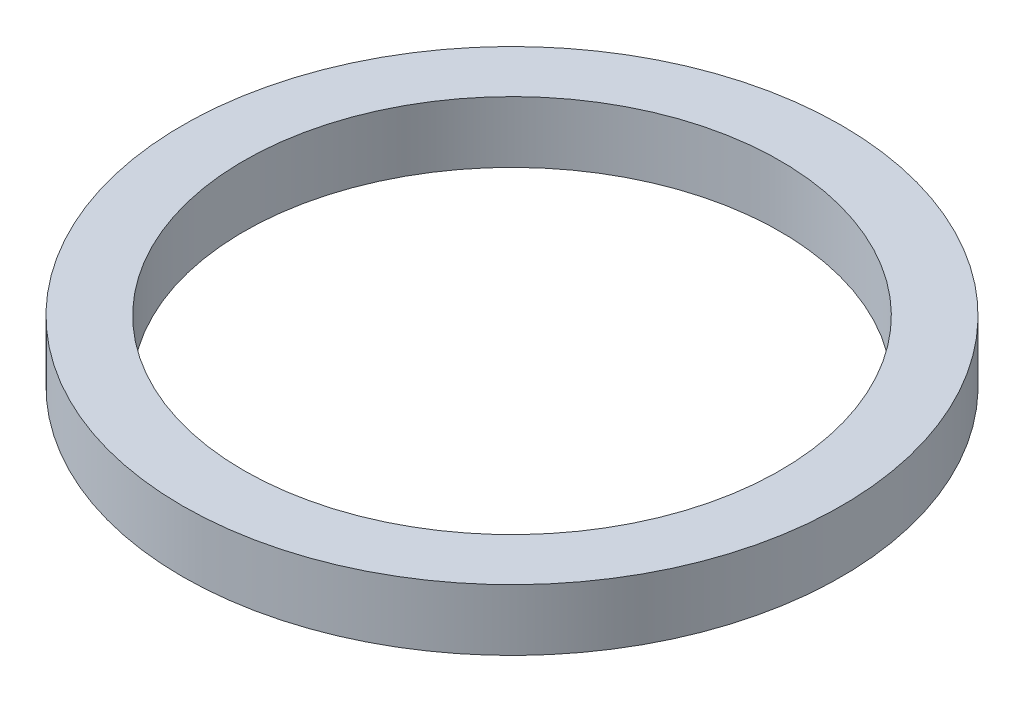
ISO-10303-21;
HEADER;
FILE_DESCRIPTION(('STEP AP214'),'2;1');
FILE_NAME('part.step','',(''),(''),'','','');
FILE_SCHEMA(('AUTOMOTIVE_DESIGN { 1 0 10303 214 1 1 1 1 }'));
ENDSEC;
DATA;
#1=APPLICATION_CONTEXT('core data for automotive mechanical design processes');
#2=APPLICATION_PROTOCOL_DEFINITION('international standard','automotive_design',2000,#1);
#3=PRODUCT_CONTEXT('',#1,'mechanical');
#4=PRODUCT('Part','Part','',(#3));
#5=PRODUCT_RELATED_PRODUCT_CATEGORY('part','',(#4));
#6=PRODUCT_DEFINITION_FORMATION('','',#4);
#7=PRODUCT_DEFINITION_CONTEXT('part definition',#1,'design');
#8=PRODUCT_DEFINITION('design','',#6,#7);
#9=PRODUCT_DEFINITION_SHAPE('','',#8);
#10=(LENGTH_UNIT() NAMED_UNIT(*) SI_UNIT(.MILLI.,.METRE.));
#11=(NAMED_UNIT(*) PLANE_ANGLE_UNIT() SI_UNIT($,.RADIAN.));
#12=(NAMED_UNIT(*) SI_UNIT($,.STERADIAN.) SOLID_ANGLE_UNIT());
#13=UNCERTAINTY_MEASURE_WITH_UNIT(LENGTH_MEASURE(1.E-05),#10,'distance_accuracy_value','');
#14=(GEOMETRIC_REPRESENTATION_CONTEXT(3) GLOBAL_UNCERTAINTY_ASSIGNED_CONTEXT((#13)) GLOBAL_UNIT_ASSIGNED_CONTEXT((#10,
#11,#12)) REPRESENTATION_CONTEXT('',''));
#15=CARTESIAN_POINT('',(0.,0.,0.));
#16=DIRECTION('',(0.,0.,1.));
#17=DIRECTION('',(1.,0.,0.));
#18=AXIS2_PLACEMENT_3D('',#15,#16,#17);
#19=CARTESIAN_POINT('',(0.,8.,0.));
#20=DIRECTION('',(0.,1.,0.));
#21=DIRECTION('',(0.,0.,1.));
#22=AXIS2_PLACEMENT_3D('',#19,#20,#21);
#23=PLANE('',#22);
#24=CARTESIAN_POINT('',(0.,8.,0.));
#25=DIRECTION('',(0.,1.,0.));
#26=DIRECTION('',(0.,0.,1.));
#27=AXIS2_PLACEMENT_3D('',#24,#25,#26);
#28=CIRCLE('',#27,43.);
#29=CARTESIAN_POINT('',(0.,8.,43.));
#30=VERTEX_POINT('',#29);
#31=EDGE_CURVE('E10',#30,#30,#28,.T.);
#32=ORIENTED_EDGE('',*,*,#31,.T.);
#33=EDGE_LOOP('',(#32));
#34=FACE_BOUND('',#33,.T.);
#35=CARTESIAN_POINT('',(0.,8.,0.));
#36=DIRECTION('',(0.,1.,0.));
#37=DIRECTION('',(0.,0.,1.));
#38=AXIS2_PLACEMENT_3D('',#35,#36,#37);
#39=CIRCLE('',#38,35.);
#40=CARTESIAN_POINT('',(0.,8.,35.));
#41=VERTEX_POINT('',#40);
#42=EDGE_CURVE('E48',#41,#41,#39,.T.);
#43=ORIENTED_EDGE('',*,*,#42,.F.);
#44=EDGE_LOOP('',(#43));
#45=FACE_BOUND('',#44,.T.);
#46=ADVANCED_FACE('F40',(#34,#45),#23,.T.);
#47=CARTESIAN_POINT('',(0.,0.,0.));
#48=DIRECTION('',(0.,1.,0.));
#49=DIRECTION('',(0.,0.,1.));
#50=AXIS2_PLACEMENT_3D('',#47,#48,#49);
#51=PLANE('',#50);
#52=CARTESIAN_POINT('',(0.,0.,0.));
#53=DIRECTION('',(0.,1.,0.));
#54=DIRECTION('',(0.,0.,1.));
#55=AXIS2_PLACEMENT_3D('',#52,#53,#54);
#56=CIRCLE('',#55,43.);
#57=CARTESIAN_POINT('',(0.,0.,43.));
#58=VERTEX_POINT('',#57);
#59=EDGE_CURVE('E41',#58,#58,#56,.T.);
#60=ORIENTED_EDGE('',*,*,#59,.F.);
#61=EDGE_LOOP('',(#60));
#62=FACE_BOUND('',#61,.T.);
#63=CARTESIAN_POINT('',(0.,0.,0.));
#64=DIRECTION('',(0.,1.,0.));
#65=DIRECTION('',(0.,0.,1.));
#66=AXIS2_PLACEMENT_3D('',#63,#64,#65);
#67=CIRCLE('',#66,35.);
#68=CARTESIAN_POINT('',(0.,0.,35.));
#69=VERTEX_POINT('',#68);
#70=EDGE_CURVE('E49',#69,#69,#67,.T.);
#71=ORIENTED_EDGE('',*,*,#70,.T.);
#72=EDGE_LOOP('',(#71));
#73=FACE_BOUND('',#72,.T.);
#74=ADVANCED_FACE('F58',(#62,#73),#51,.F.);
#75=CARTESIAN_POINT('',(0.,8.,0.));
#76=DIRECTION('',(0.,-1.,0.));
#77=DIRECTION('',(0.,0.,-1.));
#78=AXIS2_PLACEMENT_3D('',#75,#76,#77);
#79=CYLINDRICAL_SURFACE('',#78,43.);
#80=ORIENTED_EDGE('',*,*,#31,.F.);
#81=EDGE_LOOP('',(#80));
#82=FACE_BOUND('',#81,.T.);
#83=ORIENTED_EDGE('',*,*,#59,.T.);
#84=EDGE_LOOP('',(#83));
#85=FACE_BOUND('',#84,.T.);
#86=ADVANCED_FACE('F39',(#82,#85),#79,.T.);
#87=CARTESIAN_POINT('',(0.,8.,0.));
#88=DIRECTION('',(0.,-1.,0.));
#89=DIRECTION('',(0.,0.,-1.));
#90=AXIS2_PLACEMENT_3D('',#87,#88,#89);
#91=CYLINDRICAL_SURFACE('',#90,35.);
#92=ORIENTED_EDGE('',*,*,#42,.T.);
#93=EDGE_LOOP('',(#92));
#94=FACE_BOUND('',#93,.T.);
#95=ORIENTED_EDGE('',*,*,#70,.F.);
#96=EDGE_LOOP('',(#95));
#97=FACE_BOUND('',#96,.T.);
#98=ADVANCED_FACE('F57',(#94,#97),#91,.F.);
#99=CLOSED_SHELL('',(#46,#74,#86,#98));
#100=MANIFOLD_SOLID_BREP('B2',#99);
#101=ADVANCED_BREP_SHAPE_REPRESENTATION('',(#18,#100),#14);
#102=SHAPE_DEFINITION_REPRESENTATION(#9,#101);
ENDSEC;
END-ISO-10303-21;
